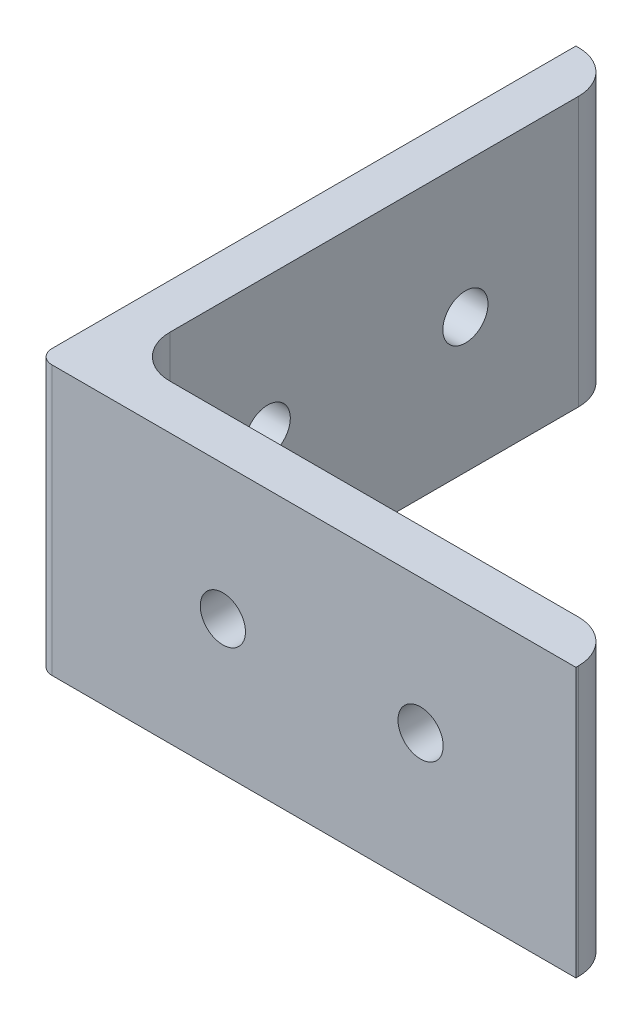
ISO-10303-21;
HEADER;
FILE_DESCRIPTION(('STEP AP214'),'2;1');
FILE_NAME('part.step','',(''),(''),'','','');
FILE_SCHEMA(('AUTOMOTIVE_DESIGN { 1 0 10303 214 1 1 1 1 }'));
ENDSEC;
DATA;
#1=APPLICATION_CONTEXT('core data for automotive mechanical design processes');
#2=APPLICATION_PROTOCOL_DEFINITION('international standard','automotive_design',2000,#1);
#3=PRODUCT_CONTEXT('',#1,'mechanical');
#4=PRODUCT('Part','Part','',(#3));
#5=PRODUCT_RELATED_PRODUCT_CATEGORY('part','',(#4));
#6=PRODUCT_DEFINITION_FORMATION('','',#4);
#7=PRODUCT_DEFINITION_CONTEXT('part definition',#1,'design');
#8=PRODUCT_DEFINITION('design','',#6,#7);
#9=PRODUCT_DEFINITION_SHAPE('','',#8);
#10=(LENGTH_UNIT() NAMED_UNIT(*) SI_UNIT(.MILLI.,.METRE.));
#11=(NAMED_UNIT(*) PLANE_ANGLE_UNIT() SI_UNIT($,.RADIAN.));
#12=(NAMED_UNIT(*) SI_UNIT($,.STERADIAN.) SOLID_ANGLE_UNIT());
#13=UNCERTAINTY_MEASURE_WITH_UNIT(LENGTH_MEASURE(1.E-05),#10,'distance_accuracy_value','');
#14=(GEOMETRIC_REPRESENTATION_CONTEXT(3) GLOBAL_UNCERTAINTY_ASSIGNED_CONTEXT((#13)) GLOBAL_UNIT_ASSIGNED_CONTEXT((#10,
#11,#12)) REPRESENTATION_CONTEXT('',''));
#15=CARTESIAN_POINT('',(0.,0.,0.));
#16=DIRECTION('',(0.,0.,1.));
#17=DIRECTION('',(1.,0.,0.));
#18=AXIS2_PLACEMENT_3D('',#15,#16,#17);
#19=CARTESIAN_POINT('',(38.1,19.05,0.));
#20=DIRECTION('',(0.,0.,-1.));
#21=DIRECTION('',(-1.,0.,0.));
#22=AXIS2_PLACEMENT_3D('',#19,#20,#21);
#23=PLANE('',#22);
#24=CARTESIAN_POINT('',(27.1,9.52500000000001,0.));
#25=DIRECTION('',(0.,0.,1.));
#26=DIRECTION('',(1.,0.,0.));
#27=AXIS2_PLACEMENT_3D('',#24,#25,#26);
#28=CIRCLE('',#27,1.6);
#29=CARTESIAN_POINT('',(28.7,9.52500000000001,0.));
#30=VERTEX_POINT('',#29);
#31=EDGE_CURVE('E198',#30,#30,#28,.T.);
#32=ORIENTED_EDGE('',*,*,#31,.F.);
#33=EDGE_LOOP('',(#32));
#34=FACE_BOUND('',#33,.T.);
#35=CARTESIAN_POINT('',(13.1,9.52500000000001,0.));
#36=DIRECTION('',(0.,0.,1.));
#37=DIRECTION('',(1.,0.,0.));
#38=AXIS2_PLACEMENT_3D('',#35,#36,#37);
#39=CIRCLE('',#38,1.6);
#40=CARTESIAN_POINT('',(14.7,9.52500000000001,0.));
#41=VERTEX_POINT('',#40);
#42=EDGE_CURVE('E188',#41,#41,#39,.T.);
#43=ORIENTED_EDGE('',*,*,#42,.F.);
#44=EDGE_LOOP('',(#43));
#45=FACE_BOUND('',#44,.T.);
#46=DIRECTION('',(1.,0.,0.));
#47=VECTOR('',#46,1.);
#48=CARTESIAN_POINT('',(38.1,19.05,0.));
#49=LINE('',#48,#47);
#50=CARTESIAN_POINT('',(1.,19.05,0.));
#51=VERTEX_POINT('',#50);
#52=CARTESIAN_POINT('',(38.1,19.05,0.));
#53=VERTEX_POINT('',#52);
#54=EDGE_CURVE('E127',#51,#53,#49,.T.);
#55=ORIENTED_EDGE('',*,*,#54,.F.);
#56=DIRECTION('',(0.,-1.,0.));
#57=VECTOR('',#56,1.);
#58=CARTESIAN_POINT('',(1.,19.05,0.));
#59=LINE('',#58,#57);
#60=CARTESIAN_POINT('',(1.,0.,0.));
#61=VERTEX_POINT('',#60);
#62=EDGE_CURVE('E183',#51,#61,#59,.T.);
#63=ORIENTED_EDGE('',*,*,#62,.T.);
#64=DIRECTION('',(1.,0.,0.));
#65=VECTOR('',#64,1.);
#66=CARTESIAN_POINT('',(38.1,0.,0.));
#67=LINE('',#66,#65);
#68=CARTESIAN_POINT('',(38.1,0.,0.));
#69=VERTEX_POINT('',#68);
#70=EDGE_CURVE('E148',#61,#69,#67,.T.);
#71=ORIENTED_EDGE('',*,*,#70,.T.);
#72=DIRECTION('',(0.,-1.,0.));
#73=VECTOR('',#72,1.);
#74=CARTESIAN_POINT('',(38.1,19.05,0.));
#75=LINE('',#74,#73);
#76=EDGE_CURVE('E143',#53,#69,#75,.T.);
#77=ORIENTED_EDGE('',*,*,#76,.F.);
#78=EDGE_LOOP('',(#55,#63,#71,#77));
#79=FACE_BOUND('',#78,.T.);
#80=ADVANCED_FACE('F48',(#34,#45,#79),#23,.F.);
#81=CARTESIAN_POINT('',(38.1,19.05,-3.17500000000004));
#82=DIRECTION('',(-1.,0.,0.));
#83=DIRECTION('',(0.,0.,1.));
#84=AXIS2_PLACEMENT_3D('',#81,#82,#83);
#85=PLANE('',#84);
#86=DIRECTION('',(0.,0.,-1.));
#87=VECTOR('',#86,1.);
#88=CARTESIAN_POINT('',(38.1,0.,-3.17500000000004));
#89=LINE('',#88,#87);
#90=CARTESIAN_POINT('',(38.1,0.,-0.175000000000036));
#91=VERTEX_POINT('',#90);
#92=EDGE_CURVE('E191',#69,#91,#89,.T.);
#93=ORIENTED_EDGE('',*,*,#92,.T.);
#94=DIRECTION('',(0.,-1.,0.));
#95=VECTOR('',#94,1.);
#96=CARTESIAN_POINT('',(38.1,19.05,-0.175000000000036));
#97=LINE('',#96,#95);
#98=CARTESIAN_POINT('',(38.1,19.05,-0.175000000000036));
#99=VERTEX_POINT('',#98);
#100=EDGE_CURVE('E145',#91,#99,#97,.F.);
#101=ORIENTED_EDGE('',*,*,#100,.T.);
#102=DIRECTION('',(0.,0.,-1.));
#103=VECTOR('',#102,1.);
#104=CARTESIAN_POINT('',(38.1,19.05,-3.17500000000004));
#105=LINE('',#104,#103);
#106=EDGE_CURVE('E130',#53,#99,#105,.T.);
#107=ORIENTED_EDGE('',*,*,#106,.F.);
#108=ORIENTED_EDGE('',*,*,#76,.T.);
#109=EDGE_LOOP('',(#93,#101,#107,#108));
#110=FACE_BOUND('',#109,.T.);
#111=ADVANCED_FACE('F142',(#110),#85,.F.);
#112=CARTESIAN_POINT('',(3.17500000000004,19.05,-3.17500000000004));
#113=DIRECTION('',(0.,0.,1.));
#114=DIRECTION('',(1.,0.,0.));
#115=AXIS2_PLACEMENT_3D('',#112,#113,#114);
#116=PLANE('',#115);
#117=CARTESIAN_POINT('',(27.1,9.52500000000001,-3.17500000000004));
#118=DIRECTION('',(0.,0.,1.));
#119=DIRECTION('',(1.,0.,0.));
#120=AXIS2_PLACEMENT_3D('',#117,#118,#119);
#121=CIRCLE('',#120,1.6);
#122=CARTESIAN_POINT('',(28.7,9.52500000000001,-3.17500000000005));
#123=VERTEX_POINT('',#122);
#124=EDGE_CURVE('E52',#123,#123,#121,.T.);
#125=ORIENTED_EDGE('',*,*,#124,.T.);
#126=EDGE_LOOP('',(#125));
#127=FACE_BOUND('',#126,.T.);
#128=CARTESIAN_POINT('',(13.1,9.52500000000001,-3.17500000000004));
#129=DIRECTION('',(0.,0.,1.));
#130=DIRECTION('',(1.,0.,0.));
#131=AXIS2_PLACEMENT_3D('',#128,#129,#130);
#132=CIRCLE('',#131,1.6);
#133=CARTESIAN_POINT('',(14.7,9.52500000000001,-3.17500000000005));
#134=VERTEX_POINT('',#133);
#135=EDGE_CURVE('E186',#134,#134,#132,.T.);
#136=ORIENTED_EDGE('',*,*,#135,.T.);
#137=EDGE_LOOP('',(#136));
#138=FACE_BOUND('',#137,.T.);
#139=DIRECTION('',(-1.,0.,0.));
#140=VECTOR('',#139,1.);
#141=CARTESIAN_POINT('',(3.17500000000004,19.05,-3.17500000000004));
#142=LINE('',#141,#140);
#143=CARTESIAN_POINT('',(35.1,19.05,-3.17500000000004));
#144=VERTEX_POINT('',#143);
#145=CARTESIAN_POINT('',(6.17500000000004,19.05,-3.17500000000004));
#146=VERTEX_POINT('',#145);
#147=EDGE_CURVE('E146',#144,#146,#142,.T.);
#148=ORIENTED_EDGE('',*,*,#147,.F.);
#149=DIRECTION('',(0.,-1.,0.));
#150=VECTOR('',#149,1.);
#151=CARTESIAN_POINT('',(35.1,19.05,-3.17500000000004));
#152=LINE('',#151,#150);
#153=CARTESIAN_POINT('',(35.1,0.,-3.17500000000004));
#154=VERTEX_POINT('',#153);
#155=EDGE_CURVE('E153',#144,#154,#152,.T.);
#156=ORIENTED_EDGE('',*,*,#155,.T.);
#157=DIRECTION('',(-1.,0.,0.));
#158=VECTOR('',#157,1.);
#159=CARTESIAN_POINT('',(3.17500000000004,0.,-3.17500000000004));
#160=LINE('',#159,#158);
#161=CARTESIAN_POINT('',(6.17500000000004,0.,-3.17500000000004));
#162=VERTEX_POINT('',#161);
#163=EDGE_CURVE('E211',#154,#162,#160,.T.);
#164=ORIENTED_EDGE('',*,*,#163,.T.);
#165=DIRECTION('',(0.,-1.,0.));
#166=VECTOR('',#165,1.);
#167=CARTESIAN_POINT('',(6.17500000000004,19.05,-3.17500000000004));
#168=LINE('',#167,#166);
#169=EDGE_CURVE('E150',#162,#146,#168,.F.);
#170=ORIENTED_EDGE('',*,*,#169,.T.);
#171=EDGE_LOOP('',(#148,#156,#164,#170));
#172=FACE_BOUND('',#171,.T.);
#173=ADVANCED_FACE('F230',(#127,#138,#172),#116,.F.);
#174=CARTESIAN_POINT('',(3.17500000000004,19.05,-38.1));
#175=DIRECTION('',(-1.,0.,0.));
#176=DIRECTION('',(0.,0.,1.));
#177=AXIS2_PLACEMENT_3D('',#174,#175,#176);
#178=PLANE('',#177);
#179=CARTESIAN_POINT('',(3.17500000000004,9.52500000000001,-13.1));
#180=DIRECTION('',(-1.,0.,0.));
#181=DIRECTION('',(0.,0.,1.));
#182=AXIS2_PLACEMENT_3D('',#179,#180,#181);
#183=CIRCLE('',#182,1.6);
#184=CARTESIAN_POINT('',(3.17500000000004,9.52500000000001,-11.5));
#185=VERTEX_POINT('',#184);
#186=EDGE_CURVE('E337',#185,#185,#183,.T.);
#187=ORIENTED_EDGE('',*,*,#186,.T.);
#188=EDGE_LOOP('',(#187));
#189=FACE_BOUND('',#188,.T.);
#190=CARTESIAN_POINT('',(3.17500000000004,9.525,-27.1));
#191=DIRECTION('',(-1.,0.,0.));
#192=DIRECTION('',(0.,0.,1.));
#193=AXIS2_PLACEMENT_3D('',#190,#191,#192);
#194=CIRCLE('',#193,1.6);
#195=CARTESIAN_POINT('',(3.17500000000004,9.525,-25.5));
#196=VERTEX_POINT('',#195);
#197=EDGE_CURVE('E341',#196,#196,#194,.T.);
#198=ORIENTED_EDGE('',*,*,#197,.T.);
#199=EDGE_LOOP('',(#198));
#200=FACE_BOUND('',#199,.T.);
#201=DIRECTION('',(0.,0.,-1.));
#202=VECTOR('',#201,1.);
#203=CARTESIAN_POINT('',(3.17500000000004,19.05,-38.1));
#204=LINE('',#203,#202);
#205=CARTESIAN_POINT('',(3.17500000000004,19.05,-6.17500000000004));
#206=VERTEX_POINT('',#205);
#207=CARTESIAN_POINT('',(3.17500000000004,19.05,-35.1));
#208=VERTEX_POINT('',#207);
#209=EDGE_CURVE('E204',#206,#208,#204,.T.);
#210=ORIENTED_EDGE('',*,*,#209,.F.);
#211=DIRECTION('',(0.,-1.,0.));
#212=VECTOR('',#211,1.);
#213=CARTESIAN_POINT('',(3.17500000000004,0.,-6.17500000000004));
#214=LINE('',#213,#212);
#215=CARTESIAN_POINT('',(3.17500000000004,0.,-6.17500000000004));
#216=VERTEX_POINT('',#215);
#217=EDGE_CURVE('E173',#206,#216,#214,.T.);
#218=ORIENTED_EDGE('',*,*,#217,.T.);
#219=DIRECTION('',(0.,0.,-1.));
#220=VECTOR('',#219,1.);
#221=CARTESIAN_POINT('',(3.17499999999993,0.,-38.1));
#222=LINE('',#221,#220);
#223=CARTESIAN_POINT('',(3.17499999999993,0.,-35.1));
#224=VERTEX_POINT('',#223);
#225=EDGE_CURVE('E214',#216,#224,#222,.T.);
#226=ORIENTED_EDGE('',*,*,#225,.T.);
#227=DIRECTION('',(0.,-1.,0.));
#228=VECTOR('',#227,1.);
#229=CARTESIAN_POINT('',(3.17500000000004,19.05,-35.1));
#230=LINE('',#229,#228);
#231=EDGE_CURVE('E171',#224,#208,#230,.F.);
#232=ORIENTED_EDGE('',*,*,#231,.T.);
#233=EDGE_LOOP('',(#210,#218,#226,#232));
#234=FACE_BOUND('',#233,.T.);
#235=ADVANCED_FACE('F238',(#189,#200,#234),#178,.F.);
#236=CARTESIAN_POINT('',(0.,19.05,-38.1));
#237=DIRECTION('',(0.,0.,1.));
#238=DIRECTION('',(1.,0.,0.));
#239=AXIS2_PLACEMENT_3D('',#236,#237,#238);
#240=PLANE('',#239);
#241=DIRECTION('',(-1.,0.,0.));
#242=VECTOR('',#241,1.);
#243=CARTESIAN_POINT('',(0.,19.05,-38.1));
#244=LINE('',#243,#242);
#245=CARTESIAN_POINT('',(0.175000000000036,19.05,-38.1));
#246=VERTEX_POINT('',#245);
#247=CARTESIAN_POINT('',(0.,19.05,-38.1));
#248=VERTEX_POINT('',#247);
#249=EDGE_CURVE('E207',#246,#248,#244,.T.);
#250=ORIENTED_EDGE('',*,*,#249,.F.);
#251=DIRECTION('',(0.,-1.,0.));
#252=VECTOR('',#251,1.);
#253=CARTESIAN_POINT('',(0.175000000000036,19.05,-38.1));
#254=LINE('',#253,#252);
#255=CARTESIAN_POINT('',(0.174999999999925,0.,-38.1));
#256=VERTEX_POINT('',#255);
#257=EDGE_CURVE('E176',#246,#256,#254,.T.);
#258=ORIENTED_EDGE('',*,*,#257,.T.);
#259=DIRECTION('',(-1.,0.,0.));
#260=VECTOR('',#259,1.);
#261=CARTESIAN_POINT('',(0.,0.,-38.1));
#262=LINE('',#261,#260);
#263=CARTESIAN_POINT('',(0.,0.,-38.1));
#264=VERTEX_POINT('',#263);
#265=EDGE_CURVE('E217',#256,#264,#262,.T.);
#266=ORIENTED_EDGE('',*,*,#265,.T.);
#267=DIRECTION('',(0.,-1.,0.));
#268=VECTOR('',#267,1.);
#269=CARTESIAN_POINT('',(0.,19.05,-38.1));
#270=LINE('',#269,#268);
#271=EDGE_CURVE('E151',#248,#264,#270,.T.);
#272=ORIENTED_EDGE('',*,*,#271,.F.);
#273=EDGE_LOOP('',(#250,#258,#266,#272));
#274=FACE_BOUND('',#273,.T.);
#275=ADVANCED_FACE('F246',(#274),#240,.F.);
#276=CARTESIAN_POINT('',(0.,19.05,0.));
#277=DIRECTION('',(1.,0.,0.));
#278=DIRECTION('',(0.,0.,-1.));
#279=AXIS2_PLACEMENT_3D('',#276,#277,#278);
#280=PLANE('',#279);
#281=CARTESIAN_POINT('',(0.,9.52500000000001,-13.1));
#282=DIRECTION('',(-1.,0.,0.));
#283=DIRECTION('',(0.,0.,1.));
#284=AXIS2_PLACEMENT_3D('',#281,#282,#283);
#285=CIRCLE('',#284,1.6);
#286=CARTESIAN_POINT('',(0.,9.52500000000001,-11.5));
#287=VERTEX_POINT('',#286);
#288=EDGE_CURVE('E334',#287,#287,#285,.T.);
#289=ORIENTED_EDGE('',*,*,#288,.F.);
#290=EDGE_LOOP('',(#289));
#291=FACE_BOUND('',#290,.T.);
#292=CARTESIAN_POINT('',(0.,9.525,-27.1));
#293=DIRECTION('',(-1.,0.,0.));
#294=DIRECTION('',(0.,0.,1.));
#295=AXIS2_PLACEMENT_3D('',#292,#293,#294);
#296=CIRCLE('',#295,1.6);
#297=CARTESIAN_POINT('',(0.,9.525,-25.5));
#298=VERTEX_POINT('',#297);
#299=EDGE_CURVE('E338',#298,#298,#296,.T.);
#300=ORIENTED_EDGE('',*,*,#299,.F.);
#301=EDGE_LOOP('',(#300));
#302=FACE_BOUND('',#301,.T.);
#303=DIRECTION('',(0.,0.,1.));
#304=VECTOR('',#303,1.);
#305=CARTESIAN_POINT('',(0.,0.,0.));
#306=LINE('',#305,#304);
#307=CARTESIAN_POINT('',(0.,0.,-1.));
#308=VERTEX_POINT('',#307);
#309=EDGE_CURVE('E137',#264,#308,#306,.T.);
#310=ORIENTED_EDGE('',*,*,#309,.T.);
#311=DIRECTION('',(0.,-1.,0.));
#312=VECTOR('',#311,1.);
#313=CARTESIAN_POINT('',(0.,19.05,-1.));
#314=LINE('',#313,#312);
#315=CARTESIAN_POINT('',(0.,19.05,-1.));
#316=VERTEX_POINT('',#315);
#317=EDGE_CURVE('E57',#308,#316,#314,.F.);
#318=ORIENTED_EDGE('',*,*,#317,.T.);
#319=DIRECTION('',(0.,0.,1.));
#320=VECTOR('',#319,1.);
#321=CARTESIAN_POINT('',(0.,19.05,0.));
#322=LINE('',#321,#320);
#323=EDGE_CURVE('E156',#248,#316,#322,.T.);
#324=ORIENTED_EDGE('',*,*,#323,.F.);
#325=ORIENTED_EDGE('',*,*,#271,.T.);
#326=EDGE_LOOP('',(#310,#318,#324,#325));
#327=FACE_BOUND('',#326,.T.);
#328=ADVANCED_FACE('F218',(#291,#302,#327),#280,.F.);
#329=CARTESIAN_POINT('',(0.,19.05,0.));
#330=DIRECTION('',(0.,-1.,0.));
#331=DIRECTION('',(0.,0.,-1.));
#332=AXIS2_PLACEMENT_3D('',#329,#330,#331);
#333=PLANE('',#332);
#334=ORIENTED_EDGE('',*,*,#323,.T.);
#335=CARTESIAN_POINT('',(1.,19.05,-1.));
#336=DIRECTION('',(0.,-1.,0.));
#337=DIRECTION('',(0.,0.,-1.));
#338=AXIS2_PLACEMENT_3D('',#335,#336,#337);
#339=CIRCLE('',#338,1.);
#340=EDGE_CURVE('E13',#316,#51,#339,.F.);
#341=ORIENTED_EDGE('',*,*,#340,.T.);
#342=ORIENTED_EDGE('',*,*,#54,.T.);
#343=ORIENTED_EDGE('',*,*,#106,.T.);
#344=CARTESIAN_POINT('',(35.1,19.05,-0.175000000000036));
#345=DIRECTION('',(0.,-1.,0.));
#346=DIRECTION('',(0.,0.,-1.));
#347=AXIS2_PLACEMENT_3D('',#344,#345,#346);
#348=CIRCLE('',#347,3.);
#349=EDGE_CURVE('E169',#99,#144,#348,.F.);
#350=ORIENTED_EDGE('',*,*,#349,.T.);
#351=ORIENTED_EDGE('',*,*,#147,.T.);
#352=CARTESIAN_POINT('',(6.17500000000004,19.05,-6.17500000000004));
#353=DIRECTION('',(0.,-1.,0.));
#354=DIRECTION('',(0.,0.,-1.));
#355=AXIS2_PLACEMENT_3D('',#352,#353,#354);
#356=CIRCLE('',#355,3.);
#357=EDGE_CURVE('E181',#146,#206,#356,.T.);
#358=ORIENTED_EDGE('',*,*,#357,.T.);
#359=ORIENTED_EDGE('',*,*,#209,.T.);
#360=CARTESIAN_POINT('',(0.175000000000036,19.05,-35.1));
#361=DIRECTION('',(0.,-1.,0.));
#362=DIRECTION('',(0.,0.,-1.));
#363=AXIS2_PLACEMENT_3D('',#360,#361,#362);
#364=CIRCLE('',#363,3.);
#365=EDGE_CURVE('E167',#208,#246,#364,.F.);
#366=ORIENTED_EDGE('',*,*,#365,.T.);
#367=ORIENTED_EDGE('',*,*,#249,.T.);
#368=EDGE_LOOP('',(#334,#341,#342,#343,#350,#351,#358,#359,#366,#367));
#369=FACE_BOUND('',#368,.T.);
#370=ADVANCED_FACE('F129',(#369),#333,.F.);
#371=CARTESIAN_POINT('',(0.,0.,0.));
#372=DIRECTION('',(0.,-1.,0.));
#373=DIRECTION('',(0.,0.,-1.));
#374=AXIS2_PLACEMENT_3D('',#371,#372,#373);
#375=PLANE('',#374);
#376=ORIENTED_EDGE('',*,*,#70,.F.);
#377=CARTESIAN_POINT('',(1.,0.,-1.));
#378=DIRECTION('',(0.,-1.,0.));
#379=DIRECTION('',(0.,0.,-1.));
#380=AXIS2_PLACEMENT_3D('',#377,#378,#379);
#381=CIRCLE('',#380,1.);
#382=EDGE_CURVE('E72',#61,#308,#381,.T.);
#383=ORIENTED_EDGE('',*,*,#382,.T.);
#384=ORIENTED_EDGE('',*,*,#309,.F.);
#385=ORIENTED_EDGE('',*,*,#265,.F.);
#386=CARTESIAN_POINT('',(0.174999999999925,0.,-35.1));
#387=DIRECTION('',(0.,-1.,0.));
#388=DIRECTION('',(0.,0.,-1.));
#389=AXIS2_PLACEMENT_3D('',#386,#387,#388);
#390=CIRCLE('',#389,3.);
#391=EDGE_CURVE('E162',#256,#224,#390,.T.);
#392=ORIENTED_EDGE('',*,*,#391,.T.);
#393=ORIENTED_EDGE('',*,*,#225,.F.);
#394=CARTESIAN_POINT('',(6.17500000000004,0.,-6.17500000000004));
#395=DIRECTION('',(0.,-1.,0.));
#396=DIRECTION('',(0.,0.,-1.));
#397=AXIS2_PLACEMENT_3D('',#394,#395,#396);
#398=CIRCLE('',#397,3.);
#399=EDGE_CURVE('E179',#216,#162,#398,.F.);
#400=ORIENTED_EDGE('',*,*,#399,.T.);
#401=ORIENTED_EDGE('',*,*,#163,.F.);
#402=CARTESIAN_POINT('',(35.1,0.,-0.175000000000036));
#403=DIRECTION('',(0.,-1.,0.));
#404=DIRECTION('',(0.,0.,-1.));
#405=AXIS2_PLACEMENT_3D('',#402,#403,#404);
#406=CIRCLE('',#405,3.);
#407=EDGE_CURVE('E164',#154,#91,#406,.T.);
#408=ORIENTED_EDGE('',*,*,#407,.T.);
#409=ORIENTED_EDGE('',*,*,#92,.F.);
#410=EDGE_LOOP('',(#376,#383,#384,#385,#392,#393,#400,#401,#408,#409));
#411=FACE_BOUND('',#410,.T.);
#412=ADVANCED_FACE('F222',(#411),#375,.T.);
#413=CARTESIAN_POINT('',(35.1,19.05,-0.175000000000036));
#414=DIRECTION('',(0.,-1.,0.));
#415=DIRECTION('',(0.,0.,-1.));
#416=AXIS2_PLACEMENT_3D('',#413,#414,#415);
#417=CYLINDRICAL_SURFACE('',#416,3.);
#418=ORIENTED_EDGE('',*,*,#349,.F.);
#419=ORIENTED_EDGE('',*,*,#100,.F.);
#420=ORIENTED_EDGE('',*,*,#407,.F.);
#421=ORIENTED_EDGE('',*,*,#155,.F.);
#422=EDGE_LOOP('',(#418,#419,#420,#421));
#423=FACE_BOUND('',#422,.T.);
#424=ADVANCED_FACE('F225',(#423),#417,.T.);
#425=CARTESIAN_POINT('',(6.17500000000004,19.05,-6.17500000000004));
#426=DIRECTION('',(0.,1.,0.));
#427=DIRECTION('',(0.,0.,1.));
#428=AXIS2_PLACEMENT_3D('',#425,#426,#427);
#429=CYLINDRICAL_SURFACE('',#428,3.);
#430=ORIENTED_EDGE('',*,*,#357,.F.);
#431=ORIENTED_EDGE('',*,*,#169,.F.);
#432=ORIENTED_EDGE('',*,*,#399,.F.);
#433=ORIENTED_EDGE('',*,*,#217,.F.);
#434=EDGE_LOOP('',(#430,#431,#432,#433));
#435=FACE_BOUND('',#434,.T.);
#436=ADVANCED_FACE('F233',(#435),#429,.F.);
#437=CARTESIAN_POINT('',(0.175000000000036,19.05,-35.1));
#438=DIRECTION('',(0.,-1.,0.));
#439=DIRECTION('',(0.,0.,-1.));
#440=AXIS2_PLACEMENT_3D('',#437,#438,#439);
#441=CYLINDRICAL_SURFACE('',#440,3.);
#442=ORIENTED_EDGE('',*,*,#365,.F.);
#443=ORIENTED_EDGE('',*,*,#231,.F.);
#444=ORIENTED_EDGE('',*,*,#391,.F.);
#445=ORIENTED_EDGE('',*,*,#257,.F.);
#446=EDGE_LOOP('',(#442,#443,#444,#445));
#447=FACE_BOUND('',#446,.T.);
#448=ADVANCED_FACE('F242',(#447),#441,.T.);
#449=CARTESIAN_POINT('',(1.,19.05,-1.));
#450=DIRECTION('',(0.,-1.,0.));
#451=DIRECTION('',(0.,0.,-1.));
#452=AXIS2_PLACEMENT_3D('',#449,#450,#451);
#453=CYLINDRICAL_SURFACE('',#452,1.);
#454=ORIENTED_EDGE('',*,*,#340,.F.);
#455=ORIENTED_EDGE('',*,*,#317,.F.);
#456=ORIENTED_EDGE('',*,*,#382,.F.);
#457=ORIENTED_EDGE('',*,*,#62,.F.);
#458=EDGE_LOOP('',(#454,#455,#456,#457));
#459=FACE_BOUND('',#458,.T.);
#460=ADVANCED_FACE('F50',(#459),#453,.T.);
#461=CARTESIAN_POINT('',(13.1,9.52500000000001,-38.1));
#462=DIRECTION('',(0.,0.,1.));
#463=DIRECTION('',(1.,0.,0.));
#464=AXIS2_PLACEMENT_3D('',#461,#462,#463);
#465=CYLINDRICAL_SURFACE('',#464,1.6);
#466=CARTESIAN_POINT('',(14.7,9.52500000000001,0.));
#467=CARTESIAN_POINT('',(14.7,9.52500000000001,-0.0330729166666752));
#468=CARTESIAN_POINT('',(14.7,9.52500000000001,-0.0661458333333434));
#469=CARTESIAN_POINT('',(14.7,9.52500000000001,-0.132291666666678));
#470=CARTESIAN_POINT('',(14.7,9.52500000000001,-0.165364583333343));
#471=CARTESIAN_POINT('',(14.7,9.52500000000001,-0.231510416666675));
#472=CARTESIAN_POINT('',(14.7,9.52500000000001,-0.264583333333341));
#473=CARTESIAN_POINT('',(14.7,9.52500000000001,-0.330729166666675));
#474=CARTESIAN_POINT('',(14.7,9.52500000000001,-0.363802083333344));
#475=CARTESIAN_POINT('',(14.7,9.52500000000001,-0.42994791666668));
#476=CARTESIAN_POINT('',(14.7,9.52500000000001,-0.463020833333348));
#477=CARTESIAN_POINT('',(14.7,9.52500000000001,-0.529166666666682));
#478=CARTESIAN_POINT('',(14.7,9.52500000000001,-0.562239583333348));
#479=CARTESIAN_POINT('',(14.7,9.52500000000001,-0.62838541666668));
#480=CARTESIAN_POINT('',(14.7,9.52500000000001,-0.661458333333346));
#481=CARTESIAN_POINT('',(14.7,9.52500000000001,-0.72760416666668));
#482=CARTESIAN_POINT('',(14.7,9.52500000000001,-0.760677083333348));
#483=CARTESIAN_POINT('',(14.7,9.52500000000001,-0.826822916666685));
#484=CARTESIAN_POINT('',(14.7,9.52500000000001,-0.859895833333353));
#485=CARTESIAN_POINT('',(14.7,9.52500000000001,-0.926041666666687));
#486=CARTESIAN_POINT('',(14.7,9.52500000000001,-0.959114583333353));
#487=CARTESIAN_POINT('',(14.7,9.52500000000001,-1.02526041666668));
#488=CARTESIAN_POINT('',(14.7,9.52500000000001,-1.05833333333335));
#489=CARTESIAN_POINT('',(14.7,9.52500000000001,-1.12447916666669));
#490=CARTESIAN_POINT('',(14.7,9.52500000000001,-1.15755208333335));
#491=CARTESIAN_POINT('',(14.7,9.52500000000001,-1.22369791666669));
#492=CARTESIAN_POINT('',(14.7,9.52500000000001,-1.25677083333336));
#493=CARTESIAN_POINT('',(14.7,9.52500000000001,-1.32291666666669));
#494=CARTESIAN_POINT('',(14.7,9.52500000000001,-1.35598958333336));
#495=CARTESIAN_POINT('',(14.7,9.52500000000001,-1.42213541666669));
#496=CARTESIAN_POINT('',(14.7,9.52500000000001,-1.45520833333336));
#497=CARTESIAN_POINT('',(14.7,9.52500000000001,-1.52135416666669));
#498=CARTESIAN_POINT('',(14.7,9.52500000000001,-1.55442708333336));
#499=CARTESIAN_POINT('',(14.7,9.52500000000001,-1.62057291666669));
#500=CARTESIAN_POINT('',(14.7,9.52500000000001,-1.65364583333336));
#501=CARTESIAN_POINT('',(14.7,9.52500000000001,-1.7197916666667));
#502=CARTESIAN_POINT('',(14.7,9.52500000000001,-1.75286458333336));
#503=CARTESIAN_POINT('',(14.7,9.52500000000001,-1.81901041666669));
#504=CARTESIAN_POINT('',(14.7,9.52500000000001,-1.85208333333336));
#505=CARTESIAN_POINT('',(14.7,9.52500000000001,-1.91822916666669));
#506=CARTESIAN_POINT('',(14.7,9.52500000000001,-1.95130208333336));
#507=CARTESIAN_POINT('',(14.7,9.52500000000001,-2.0174479166667));
#508=CARTESIAN_POINT('',(14.7,9.52500000000001,-2.05052083333337));
#509=CARTESIAN_POINT('',(14.7,9.52500000000001,-2.1166666666667));
#510=CARTESIAN_POINT('',(14.7,9.52500000000001,-2.14973958333337));
#511=CARTESIAN_POINT('',(14.7,9.52500000000001,-2.2158854166667));
#512=CARTESIAN_POINT('',(14.7,9.52500000000001,-2.24895833333337));
#513=CARTESIAN_POINT('',(14.7,9.52500000000001,-2.3151041666667));
#514=CARTESIAN_POINT('',(14.7,9.52500000000001,-2.34817708333337));
#515=CARTESIAN_POINT('',(14.7,9.52500000000001,-2.4143229166667));
#516=CARTESIAN_POINT('',(14.7,9.52500000000001,-2.44739583333337));
#517=CARTESIAN_POINT('',(14.7,9.52500000000001,-2.51354166666671));
#518=CARTESIAN_POINT('',(14.7,9.52500000000001,-2.54661458333337));
#519=CARTESIAN_POINT('',(14.7,9.52500000000001,-2.6127604166667));
#520=CARTESIAN_POINT('',(14.7,9.52500000000001,-2.64583333333337));
#521=CARTESIAN_POINT('',(14.7,9.52500000000001,-2.7119791666667));
#522=CARTESIAN_POINT('',(14.7,9.52500000000001,-2.74505208333337));
#523=CARTESIAN_POINT('',(14.7,9.52500000000001,-2.81119791666671));
#524=CARTESIAN_POINT('',(14.7,9.52500000000001,-2.84427083333338));
#525=CARTESIAN_POINT('',(14.7,9.52500000000001,-2.91041666666671));
#526=CARTESIAN_POINT('',(14.7,9.52500000000001,-2.94348958333338));
#527=CARTESIAN_POINT('',(14.7,9.52500000000001,-3.00963541666671));
#528=CARTESIAN_POINT('',(14.7,9.52500000000001,-3.04270833333338));
#529=CARTESIAN_POINT('',(14.7,9.52500000000001,-3.10885416666671));
#530=CARTESIAN_POINT('',(14.7,9.52500000000001,-3.14192708333338));
#531=CARTESIAN_POINT('',(14.7,9.52500000000001,-3.17500000000005));
#532=B_SPLINE_CURVE_WITH_KNOTS('',3,(#466,#467,#468,#469,#470,#471,#472,#473,#474,#475,#476,
#477,#478,#479,#480,#481,#482,#483,#484,#485,#486,#487,#488,#489,#490,#491,#492,#493,#494,#495,
#496,#497,#498,#499,#500,#501,#502,#503,#504,#505,#506,#507,#508,#509,#510,#511,#512,#513,#514,
#515,#516,#517,#518,#519,#520,#521,#522,#523,#524,#525,#526,#527,#528,#529,#530,#531),
.UNSPECIFIED.,.F.,.F.,(4,2,2,2,2,2,2,2,2,2,2,2,2,2,2,2,2,2,2,2,2,2,2,2,2,2,2,2,2,2,2,2,4),(0.,
0.0992187500000047,0.198437500000002,0.29765625,0.396875000000005,0.49609375000001,
0.595312500000007,0.694531250000005,0.79375000000001,0.892968750000014,0.992187500000012,
1.09140625000001,1.19062500000001,1.28984375000002,1.38906250000002,1.48828125000001,
1.58750000000002,1.68671875000002,1.78593750000002,1.88515625000002,1.98437500000002,
2.08359375000003,2.18281250000003,2.28203125000002,2.38125000000003,2.48046875000003,
2.57968750000003,2.67890625000003,2.77812500000003,2.87734375000004,2.97656250000004,
3.07578125000003,3.17500000000004),.UNSPECIFIED.);
#533=EDGE_CURVE('BSEAM275',#41,#134,#532,.T.);
#534=ORIENTED_EDGE('',*,*,#42,.T.);
#535=ORIENTED_EDGE('',*,*,#135,.F.);
#536=ORIENTED_EDGE('',*,*,#533,.T.);
#537=ORIENTED_EDGE('',*,*,#533,.F.);
#538=EDGE_LOOP('',(#534,#536,#535,#537));
#539=FACE_BOUND('',#538,.T.);
#540=ADVANCED_FACE('F275',(#539),#465,.F.);
#541=CARTESIAN_POINT('',(27.1,9.52500000000001,-38.1));
#542=DIRECTION('',(0.,0.,1.));
#543=DIRECTION('',(1.,0.,0.));
#544=AXIS2_PLACEMENT_3D('',#541,#542,#543);
#545=CYLINDRICAL_SURFACE('',#544,1.6);
#546=CARTESIAN_POINT('',(28.7,9.52500000000001,0.));
#547=CARTESIAN_POINT('',(28.7,9.52500000000001,-0.0330729166666752));
#548=CARTESIAN_POINT('',(28.7,9.52500000000001,-0.0661458333333434));
#549=CARTESIAN_POINT('',(28.7,9.52500000000001,-0.132291666666678));
#550=CARTESIAN_POINT('',(28.7,9.52500000000001,-0.165364583333343));
#551=CARTESIAN_POINT('',(28.7,9.52500000000001,-0.231510416666675));
#552=CARTESIAN_POINT('',(28.7,9.52500000000001,-0.264583333333341));
#553=CARTESIAN_POINT('',(28.7,9.52500000000001,-0.330729166666675));
#554=CARTESIAN_POINT('',(28.7,9.52500000000001,-0.363802083333344));
#555=CARTESIAN_POINT('',(28.7,9.52500000000001,-0.42994791666668));
#556=CARTESIAN_POINT('',(28.7,9.52500000000001,-0.463020833333348));
#557=CARTESIAN_POINT('',(28.7,9.52500000000001,-0.529166666666682));
#558=CARTESIAN_POINT('',(28.7,9.52500000000001,-0.562239583333348));
#559=CARTESIAN_POINT('',(28.7,9.52500000000001,-0.62838541666668));
#560=CARTESIAN_POINT('',(28.7,9.52500000000001,-0.661458333333346));
#561=CARTESIAN_POINT('',(28.7,9.52500000000001,-0.72760416666668));
#562=CARTESIAN_POINT('',(28.7,9.52500000000001,-0.760677083333348));
#563=CARTESIAN_POINT('',(28.7,9.52500000000001,-0.826822916666685));
#564=CARTESIAN_POINT('',(28.7,9.52500000000001,-0.859895833333353));
#565=CARTESIAN_POINT('',(28.7,9.52500000000001,-0.926041666666687));
#566=CARTESIAN_POINT('',(28.7,9.52500000000001,-0.959114583333353));
#567=CARTESIAN_POINT('',(28.7,9.52500000000001,-1.02526041666668));
#568=CARTESIAN_POINT('',(28.7,9.52500000000001,-1.05833333333335));
#569=CARTESIAN_POINT('',(28.7,9.52500000000001,-1.12447916666669));
#570=CARTESIAN_POINT('',(28.7,9.52500000000001,-1.15755208333335));
#571=CARTESIAN_POINT('',(28.7,9.52500000000001,-1.22369791666669));
#572=CARTESIAN_POINT('',(28.7,9.52500000000001,-1.25677083333336));
#573=CARTESIAN_POINT('',(28.7,9.52500000000001,-1.32291666666669));
#574=CARTESIAN_POINT('',(28.7,9.52500000000001,-1.35598958333336));
#575=CARTESIAN_POINT('',(28.7,9.52500000000001,-1.42213541666669));
#576=CARTESIAN_POINT('',(28.7,9.52500000000001,-1.45520833333336));
#577=CARTESIAN_POINT('',(28.7,9.52500000000001,-1.52135416666669));
#578=CARTESIAN_POINT('',(28.7,9.52500000000001,-1.55442708333336));
#579=CARTESIAN_POINT('',(28.7,9.52500000000001,-1.62057291666669));
#580=CARTESIAN_POINT('',(28.7,9.52500000000001,-1.65364583333336));
#581=CARTESIAN_POINT('',(28.7,9.52500000000001,-1.7197916666667));
#582=CARTESIAN_POINT('',(28.7,9.52500000000001,-1.75286458333336));
#583=CARTESIAN_POINT('',(28.7,9.52500000000001,-1.81901041666669));
#584=CARTESIAN_POINT('',(28.7,9.52500000000001,-1.85208333333336));
#585=CARTESIAN_POINT('',(28.7,9.52500000000001,-1.91822916666669));
#586=CARTESIAN_POINT('',(28.7,9.52500000000001,-1.95130208333336));
#587=CARTESIAN_POINT('',(28.7,9.52500000000001,-2.0174479166667));
#588=CARTESIAN_POINT('',(28.7,9.52500000000001,-2.05052083333337));
#589=CARTESIAN_POINT('',(28.7,9.52500000000001,-2.1166666666667));
#590=CARTESIAN_POINT('',(28.7,9.52500000000001,-2.14973958333337));
#591=CARTESIAN_POINT('',(28.7,9.52500000000001,-2.2158854166667));
#592=CARTESIAN_POINT('',(28.7,9.52500000000001,-2.24895833333337));
#593=CARTESIAN_POINT('',(28.7,9.52500000000001,-2.3151041666667));
#594=CARTESIAN_POINT('',(28.7,9.52500000000001,-2.34817708333337));
#595=CARTESIAN_POINT('',(28.7,9.52500000000001,-2.4143229166667));
#596=CARTESIAN_POINT('',(28.7,9.52500000000001,-2.44739583333337));
#597=CARTESIAN_POINT('',(28.7,9.52500000000001,-2.51354166666671));
#598=CARTESIAN_POINT('',(28.7,9.52500000000001,-2.54661458333337));
#599=CARTESIAN_POINT('',(28.7,9.52500000000001,-2.6127604166667));
#600=CARTESIAN_POINT('',(28.7,9.52500000000001,-2.64583333333337));
#601=CARTESIAN_POINT('',(28.7,9.52500000000001,-2.7119791666667));
#602=CARTESIAN_POINT('',(28.7,9.52500000000001,-2.74505208333337));
#603=CARTESIAN_POINT('',(28.7,9.52500000000001,-2.81119791666671));
#604=CARTESIAN_POINT('',(28.7,9.52500000000001,-2.84427083333338));
#605=CARTESIAN_POINT('',(28.7,9.52500000000001,-2.91041666666671));
#606=CARTESIAN_POINT('',(28.7,9.52500000000001,-2.94348958333338));
#607=CARTESIAN_POINT('',(28.7,9.52500000000001,-3.00963541666671));
#608=CARTESIAN_POINT('',(28.7,9.52500000000001,-3.04270833333338));
#609=CARTESIAN_POINT('',(28.7,9.52500000000001,-3.10885416666671));
#610=CARTESIAN_POINT('',(28.7,9.52500000000001,-3.14192708333338));
#611=CARTESIAN_POINT('',(28.7,9.52500000000001,-3.17500000000005));
#612=B_SPLINE_CURVE_WITH_KNOTS('',3,(#546,#547,#548,#549,#550,#551,#552,#553,#554,#555,#556,
#557,#558,#559,#560,#561,#562,#563,#564,#565,#566,#567,#568,#569,#570,#571,#572,#573,#574,#575,
#576,#577,#578,#579,#580,#581,#582,#583,#584,#585,#586,#587,#588,#589,#590,#591,#592,#593,#594,
#595,#596,#597,#598,#599,#600,#601,#602,#603,#604,#605,#606,#607,#608,#609,#610,#611),
.UNSPECIFIED.,.F.,.F.,(4,2,2,2,2,2,2,2,2,2,2,2,2,2,2,2,2,2,2,2,2,2,2,2,2,2,2,2,2,2,2,2,4),(0.,
0.0992187500000047,0.198437500000002,0.29765625,0.396875000000005,0.49609375000001,
0.595312500000007,0.694531250000005,0.79375000000001,0.892968750000014,0.992187500000012,
1.09140625000001,1.19062500000001,1.28984375000002,1.38906250000002,1.48828125000001,
1.58750000000002,1.68671875000002,1.78593750000002,1.88515625000002,1.98437500000002,
2.08359375000003,2.18281250000003,2.28203125000002,2.38125000000003,2.48046875000003,
2.57968750000003,2.67890625000003,2.77812500000003,2.87734375000004,2.97656250000004,
3.07578125000003,3.17500000000004),.UNSPECIFIED.);
#613=EDGE_CURVE('BSEAM279',#30,#123,#612,.T.);
#614=ORIENTED_EDGE('',*,*,#31,.T.);
#615=ORIENTED_EDGE('',*,*,#124,.F.);
#616=ORIENTED_EDGE('',*,*,#613,.T.);
#617=ORIENTED_EDGE('',*,*,#613,.F.);
#618=EDGE_LOOP('',(#614,#616,#615,#617));
#619=FACE_BOUND('',#618,.T.);
#620=ADVANCED_FACE('F279',(#619),#545,.F.);
#621=CARTESIAN_POINT('',(38.1,9.52500000000001,-27.1));
#622=DIRECTION('',(-1.,0.,0.));
#623=DIRECTION('',(0.,0.,1.));
#624=AXIS2_PLACEMENT_3D('',#621,#622,#623);
#625=CYLINDRICAL_SURFACE('',#624,1.6);
#626=ORIENTED_EDGE('',*,*,#299,.T.);
#627=EDGE_LOOP('',(#626));
#628=FACE_BOUND('',#627,.T.);
#629=ORIENTED_EDGE('',*,*,#197,.F.);
#630=EDGE_LOOP('',(#629));
#631=FACE_BOUND('',#630,.T.);
#632=ADVANCED_FACE('F284',(#628,#631),#625,.F.);
#633=CARTESIAN_POINT('',(38.1,9.52500000000001,-13.1));
#634=DIRECTION('',(-1.,0.,0.));
#635=DIRECTION('',(0.,0.,1.));
#636=AXIS2_PLACEMENT_3D('',#633,#634,#635);
#637=CYLINDRICAL_SURFACE('',#636,1.6);
#638=ORIENTED_EDGE('',*,*,#288,.T.);
#639=EDGE_LOOP('',(#638));
#640=FACE_BOUND('',#639,.T.);
#641=ORIENTED_EDGE('',*,*,#186,.F.);
#642=EDGE_LOOP('',(#641));
#643=FACE_BOUND('',#642,.T.);
#644=ADVANCED_FACE('F322',(#640,#643),#637,.F.);
#645=CLOSED_SHELL('',(#80,#111,#173,#235,#275,#328,#370,#412,#424,#436,#448,#460,#540,#620,#632,#644));
#646=MANIFOLD_SOLID_BREP('B2',#645);
#647=ADVANCED_BREP_SHAPE_REPRESENTATION('',(#18,#646),#14);
#648=SHAPE_DEFINITION_REPRESENTATION(#9,#647);
ENDSEC;
END-ISO-10303-21;
